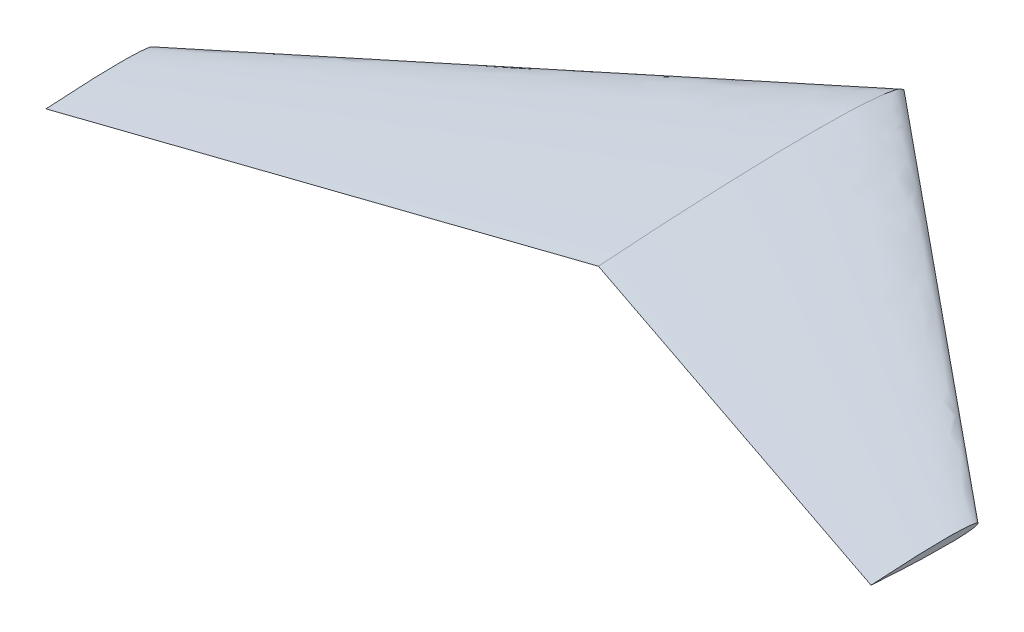
ISO-10303-21;
HEADER;
FILE_DESCRIPTION(('STEP AP214'),'2;1');
FILE_NAME('part.step','',(''),(''),'','','');
FILE_SCHEMA(('AUTOMOTIVE_DESIGN { 1 0 10303 214 1 1 1 1 }'));
ENDSEC;
DATA;
#1=APPLICATION_CONTEXT('core data for automotive mechanical design processes');
#2=APPLICATION_PROTOCOL_DEFINITION('international standard','automotive_design',2000,#1);
#3=PRODUCT_CONTEXT('',#1,'mechanical');
#4=PRODUCT('Part','Part','',(#3));
#5=PRODUCT_RELATED_PRODUCT_CATEGORY('part','',(#4));
#6=PRODUCT_DEFINITION_FORMATION('','',#4);
#7=PRODUCT_DEFINITION_CONTEXT('part definition',#1,'design');
#8=PRODUCT_DEFINITION('design','',#6,#7);
#9=PRODUCT_DEFINITION_SHAPE('','',#8);
#10=(LENGTH_UNIT() NAMED_UNIT(*) SI_UNIT(.MILLI.,.METRE.));
#11=(NAMED_UNIT(*) PLANE_ANGLE_UNIT() SI_UNIT($,.RADIAN.));
#12=(NAMED_UNIT(*) SI_UNIT($,.STERADIAN.) SOLID_ANGLE_UNIT());
#13=UNCERTAINTY_MEASURE_WITH_UNIT(LENGTH_MEASURE(1.E-05),#10,'distance_accuracy_value','');
#14=(GEOMETRIC_REPRESENTATION_CONTEXT(3) GLOBAL_UNCERTAINTY_ASSIGNED_CONTEXT((#13)) GLOBAL_UNIT_ASSIGNED_CONTEXT((#10,
#11,#12)) REPRESENTATION_CONTEXT('',''));
#15=CARTESIAN_POINT('',(0.,0.,0.));
#16=DIRECTION('',(0.,0.,1.));
#17=DIRECTION('',(1.,0.,0.));
#18=AXIS2_PLACEMENT_3D('',#15,#16,#17);
#19=CARTESIAN_POINT('',(11359.2161155703,76.8514653206255,10788.4222084638));
#20=DIRECTION('',(-1.,0.,0.));
#21=DIRECTION('',(0.,0.,-1.));
#22=AXIS2_PLACEMENT_3D('',#19,#20,#21);
#23=PLANE('',#22);
#24=CARTESIAN_POINT('',(11359.2161155703,-1.34095460673236E-12,12266.1037591124));
#25=CARTESIAN_POINT('',(11359.2161155703,18.8203520967069,11971.8910815032));
#26=CARTESIAN_POINT('',(11359.2161155703,49.9882583828807,11481.3378290713));
#27=CARTESIAN_POINT('',(11359.2161155703,70.9835794585614,10990.1821505142));
#28=CARTESIAN_POINT('',(11359.2161155703,82.3956799870032,10597.8339155743));
#29=CARTESIAN_POINT('',(11359.2161155703,85.4412528497841,10401.1726121632));
#30=CARTESIAN_POINT('',(11359.2161155703,86.9538383032913,10106.6703660128));
#31=CARTESIAN_POINT('',(11359.2161155703,86.9309217643893,10007.9894461031));
#32=CARTESIAN_POINT('',(11359.2161155703,82.4823559531746,9863.96128521647));
#33=CARTESIAN_POINT('',(11359.2161155703,80.1454595299337,9812.41655254454));
#34=CARTESIAN_POINT('',(11359.2161155703,74.7337293030059,9714.01184201355));
#35=CARTESIAN_POINT('',(11359.2161155703,71.3004715154824,9661.46365869842));
#36=CARTESIAN_POINT('',(11359.2161155703,65.8455880886711,9591.98239167028));
#37=CARTESIAN_POINT('',(11359.2161155703,63.8302413863627,9568.27058077111));
#38=CARTESIAN_POINT('',(11359.2161155703,58.7328780892101,9522.39970973608));
#39=CARTESIAN_POINT('',(11359.2161155703,55.1925855489482,9496.91518607539));
#40=CARTESIAN_POINT('',(11359.2161155703,45.0254946563833,9419.06959226612));
#41=CARTESIAN_POINT('',(11359.2161155703,39.0349502011655,9362.32915647395));
#42=CARTESIAN_POINT('',(11359.2161155703,0.,9321.12180322383));
#43=B_SPLINE_CURVE_WITH_KNOTS('',3,(#24,#25,#26,#27,#28,#29,#30,#31,#32,#33,#34,#35,#36,#37,#38,
#39,#40,#41,#42),.UNSPECIFIED.,.F.,.F.,(4,1,1,1,1,1,1,1,1,1,1,1,1,1,1,1,4),(0.,
0.298931815970666,0.498152968932553,0.498299211220126,0.696834066796415,0.697522121171649,
0.796796462208503,0.796844070583475,0.843589068570306,0.849087559843308,0.896763932817385,
0.896989321780881,0.919683005075993,0.920855221312246,0.943853286653914,0.945874325951042,1.),.UNSPECIFIED.);
#44=CARTESIAN_POINT('',(11359.2161155703,0.,9321.12180322383));
#45=VERTEX_POINT('',#44);
#46=CARTESIAN_POINT('',(11359.2161155703,-1.33877835778621E-12,12266.1037591124));
#47=VERTEX_POINT('',#46);
#48=EDGE_CURVE('E90',#45,#47,#43,.F.);
#49=ORIENTED_EDGE('',*,*,#48,.T.);
#50=CARTESIAN_POINT('',(11359.2161155703,0.,9321.12180322383));
#51=CARTESIAN_POINT('',(11359.2161155703,-39.0349502011679,9362.32915647395));
#52=CARTESIAN_POINT('',(11359.2161155703,-45.0254946563853,9419.06959226613));
#53=CARTESIAN_POINT('',(11359.2161155703,-55.1925855489501,9496.91518607539));
#54=CARTESIAN_POINT('',(11359.2161155703,-58.7328780892121,9522.39970973607));
#55=CARTESIAN_POINT('',(11359.2161155703,-63.8302413863647,9568.2705807711));
#56=CARTESIAN_POINT('',(11359.2161155703,-65.8455880886731,9591.98239167028));
#57=CARTESIAN_POINT('',(11359.2161155703,-71.3004715154844,9661.46365869842));
#58=CARTESIAN_POINT('',(11359.2161155703,-74.7337293030079,9714.01184201355));
#59=CARTESIAN_POINT('',(11359.2161155703,-80.1454595299357,9812.41655254454));
#60=CARTESIAN_POINT('',(11359.2161155703,-82.4823559531767,9863.96128521647));
#61=CARTESIAN_POINT('',(11359.2161155703,-86.9309217643914,10007.9894461031));
#62=CARTESIAN_POINT('',(11359.2161155703,-86.9538383032934,10106.6703660128));
#63=CARTESIAN_POINT('',(11359.2161155703,-85.4412528497863,10401.1726121632));
#64=CARTESIAN_POINT('',(11359.2161155703,-82.3956799870054,10597.8339155743));
#65=CARTESIAN_POINT('',(11359.2161155703,-70.9835794585637,10990.1821505142));
#66=CARTESIAN_POINT('',(11359.2161155703,-49.9882583828832,11481.3378290713));
#67=CARTESIAN_POINT('',(11359.2161155703,-18.8203520967096,11971.8910815032));
#68=CARTESIAN_POINT('',(11359.2161155703,-1.33877835778621E-12,12266.1037591124));
#69=B_SPLINE_CURVE_WITH_KNOTS('',3,(#50,#51,#52,#53,#54,#55,#56,#57,#58,#59,#60,#61,#62,#63,#64,
#65,#66,#67,#68),.UNSPECIFIED.,.F.,.F.,(4,1,1,1,1,1,1,1,1,1,1,1,1,1,1,1,4),(0.,
0.0541256740489585,0.0561467133460857,0.0791447786877544,0.0803169949240068,0.103010678219119,
0.103236067182615,0.150912440156692,0.156410931429694,0.203155929416525,0.203203537791498,
0.302477878828351,0.303165933203585,0.501700788779874,0.501847031067447,0.701068184029334,1.),.UNSPECIFIED.);
#70=EDGE_CURVE('E121',#47,#45,#69,.F.);
#71=ORIENTED_EDGE('',*,*,#70,.T.);
#72=EDGE_LOOP('',(#49,#71));
#73=FACE_BOUND('',#72,.T.);
#74=ADVANCED_FACE('F87',(#73),#23,.F.);
#75=CARTESIAN_POINT('',(-11359.2161155703,76.8514653206255,10788.4222084638));
#76=DIRECTION('',(1.,0.,0.));
#77=DIRECTION('',(0.,0.,-1.));
#78=AXIS2_PLACEMENT_3D('',#75,#76,#77);
#79=PLANE('',#78);
#80=CARTESIAN_POINT('',(-11359.2161155703,-1.34095460673236E-12,12266.1037591124));
#81=CARTESIAN_POINT('',(-11359.2161155703,18.8203520967069,11971.8910815032));
#82=CARTESIAN_POINT('',(-11359.2161155703,49.9882583828807,11481.3378290713));
#83=CARTESIAN_POINT('',(-11359.2161155703,70.9835794585614,10990.1821505142));
#84=CARTESIAN_POINT('',(-11359.2161155703,82.3956799870032,10597.8339155743));
#85=CARTESIAN_POINT('',(-11359.2161155703,85.4412528497841,10401.1726121632));
#86=CARTESIAN_POINT('',(-11359.2161155703,86.9538383032913,10106.6703660128));
#87=CARTESIAN_POINT('',(-11359.2161155703,86.9309217643893,10007.9894461031));
#88=CARTESIAN_POINT('',(-11359.2161155703,82.4823559531746,9863.96128521647));
#89=CARTESIAN_POINT('',(-11359.2161155703,80.1454595299337,9812.41655254454));
#90=CARTESIAN_POINT('',(-11359.2161155703,74.7337293030059,9714.01184201355));
#91=CARTESIAN_POINT('',(-11359.2161155703,71.3004715154824,9661.46365869842));
#92=CARTESIAN_POINT('',(-11359.2161155703,65.8455880886711,9591.98239167028));
#93=CARTESIAN_POINT('',(-11359.2161155703,63.8302413863627,9568.27058077111));
#94=CARTESIAN_POINT('',(-11359.2161155703,58.7328780892101,9522.39970973608));
#95=CARTESIAN_POINT('',(-11359.2161155703,55.1925855489482,9496.91518607539));
#96=CARTESIAN_POINT('',(-11359.2161155703,45.0254946563833,9419.06959226612));
#97=CARTESIAN_POINT('',(-11359.2161155703,39.0349502011655,9362.32915647395));
#98=CARTESIAN_POINT('',(-11359.2161155703,0.,9321.12180322383));
#99=B_SPLINE_CURVE_WITH_KNOTS('',3,(#80,#81,#82,#83,#84,#85,#86,#87,#88,#89,#90,#91,#92,#93,#94,
#95,#96,#97,#98),.UNSPECIFIED.,.F.,.F.,(4,1,1,1,1,1,1,1,1,1,1,1,1,1,1,1,4),(0.,
0.298931815970666,0.498152968932553,0.498299211220126,0.696834066796415,0.697522121171649,
0.796796462208503,0.796844070583475,0.843589068570306,0.849087559843308,0.896763932817385,
0.896989321780881,0.919683005075993,0.920855221312246,0.943853286653914,0.945874325951042,1.),.UNSPECIFIED.);
#100=CARTESIAN_POINT('',(-11359.2161155703,0.,9321.12180322383));
#101=VERTEX_POINT('',#100);
#102=CARTESIAN_POINT('',(-11359.2161155703,-1.33877835778621E-12,12266.1037591124));
#103=VERTEX_POINT('',#102);
#104=EDGE_CURVE('E99',#101,#103,#99,.F.);
#105=ORIENTED_EDGE('',*,*,#104,.F.);
#106=CARTESIAN_POINT('',(-11359.2161155703,0.,9321.12180322383));
#107=CARTESIAN_POINT('',(-11359.2161155703,-39.0349502011679,9362.32915647395));
#108=CARTESIAN_POINT('',(-11359.2161155703,-45.0254946563853,9419.06959226613));
#109=CARTESIAN_POINT('',(-11359.2161155703,-55.1925855489501,9496.91518607539));
#110=CARTESIAN_POINT('',(-11359.2161155703,-58.7328780892121,9522.39970973607));
#111=CARTESIAN_POINT('',(-11359.2161155703,-63.8302413863647,9568.2705807711));
#112=CARTESIAN_POINT('',(-11359.2161155703,-65.8455880886731,9591.98239167028));
#113=CARTESIAN_POINT('',(-11359.2161155703,-71.3004715154844,9661.46365869842));
#114=CARTESIAN_POINT('',(-11359.2161155703,-74.7337293030079,9714.01184201355));
#115=CARTESIAN_POINT('',(-11359.2161155703,-80.1454595299357,9812.41655254454));
#116=CARTESIAN_POINT('',(-11359.2161155703,-82.4823559531767,9863.96128521647));
#117=CARTESIAN_POINT('',(-11359.2161155703,-86.9309217643914,10007.9894461031));
#118=CARTESIAN_POINT('',(-11359.2161155703,-86.9538383032934,10106.6703660128));
#119=CARTESIAN_POINT('',(-11359.2161155703,-85.4412528497863,10401.1726121632));
#120=CARTESIAN_POINT('',(-11359.2161155703,-82.3956799870054,10597.8339155743));
#121=CARTESIAN_POINT('',(-11359.2161155703,-70.9835794585637,10990.1821505142));
#122=CARTESIAN_POINT('',(-11359.2161155703,-49.9882583828832,11481.3378290713));
#123=CARTESIAN_POINT('',(-11359.2161155703,-18.8203520967096,11971.8910815032));
#124=CARTESIAN_POINT('',(-11359.2161155703,-1.33877835778621E-12,12266.1037591124));
#125=B_SPLINE_CURVE_WITH_KNOTS('',3,(#106,#107,#108,#109,#110,#111,#112,#113,#114,#115,#116,
#117,#118,#119,#120,#121,#122,#123,#124),.UNSPECIFIED.,.F.,.F.,(4,1,1,1,1,1,1,1,1,1,1,1,1,1,1,1,
4),(0.,0.0541256740489585,0.0561467133460857,0.0791447786877544,0.0803169949240068,
0.103010678219119,0.103236067182615,0.150912440156692,0.156410931429694,0.203155929416525,
0.203203537791498,0.302477878828351,0.303165933203585,0.501700788779874,0.501847031067447,
0.701068184029334,1.),.UNSPECIFIED.);
#126=EDGE_CURVE('E159',#103,#101,#125,.F.);
#127=ORIENTED_EDGE('',*,*,#126,.F.);
#128=EDGE_LOOP('',(#105,#127));
#129=FACE_BOUND('',#128,.T.);
#130=ADVANCED_FACE('F213',(#129),#79,.F.);
#131=CARTESIAN_POINT('',(0.,-1.03584151514388E-12,8414.2341596817));
#132=CARTESIAN_POINT('',(11359.2161155703,-1.34095460673236E-12,12266.1037591124));
#133=CARTESIAN_POINT('',(0.,64.7920514607161,7574.06443176734));
#134=CARTESIAN_POINT('',(11359.2161155703,18.8203520967069,11971.8910815032));
#135=CARTESIAN_POINT('',(0.,148.494411022616,6172.1296219586));
#136=CARTESIAN_POINT('',(11359.2161155703,49.9882583828807,11481.3378290713));
#137=CARTESIAN_POINT('',(0.,208.057487147225,4768.80033309058));
#138=CARTESIAN_POINT('',(11359.2161155703,70.9835794585614,10990.1821505142));
#139=CARTESIAN_POINT('',(0.,244.442770083536,3647.59962187171));
#140=CARTESIAN_POINT('',(11359.2161155703,82.3956799870032,10597.8339155743));
#141=CARTESIAN_POINT('',(0.,257.091372536718,3085.51507252471));
#142=CARTESIAN_POINT('',(11359.2161155703,85.4412528497841,10401.1726121632));
#143=CARTESIAN_POINT('',(0.,253.102036890415,2244.22059630675));
#144=CARTESIAN_POINT('',(11359.2161155703,86.9538383032913,10106.6703660128));
#145=CARTESIAN_POINT('',(0.,247.902646496169,1962.39382293248));
#146=CARTESIAN_POINT('',(11359.2161155703,86.9309217643893,10007.9894461031));
#147=CARTESIAN_POINT('',(0.,240.689336539155,1550.55652902122));
#148=CARTESIAN_POINT('',(11359.2161155703,82.4823559531746,9863.96128521647));
#149=CARTESIAN_POINT('',(0.,238.171676754806,1403.08364495362));
#150=CARTESIAN_POINT('',(11359.2161155703,80.1454595299337,9812.41655254454));
#151=CARTESIAN_POINT('',(0.,222.91221545098,1121.94901643392));
#152=CARTESIAN_POINT('',(11359.2161155703,74.7337293030059,9714.01184201355));
#153=CARTESIAN_POINT('',(0.,208.396099353381,972.109774250955));
#154=CARTESIAN_POINT('',(11359.2161155703,71.3004715154824,9661.46365869842));
#155=CARTESIAN_POINT('',(0.,194.440638219348,773.448943042979));
#156=CARTESIAN_POINT('',(11359.2161155703,65.8455880886711,9591.98239167028));
#157=CARTESIAN_POINT('',(0.,190.542859216547,705.559975496836));
#158=CARTESIAN_POINT('',(11359.2161155703,63.8302413863627,9568.27058077111));
#159=CARTESIAN_POINT('',(0.,176.271721196786,574.429923088583));
#160=CARTESIAN_POINT('',(11359.2161155703,58.7328780892101,9522.39970973608));
#161=CARTESIAN_POINT('',(0.,164.724712547587,501.620254564058));
#162=CARTESIAN_POINT('',(11359.2161155703,55.1925855489482,9496.91518607539));
#163=CARTESIAN_POINT('',(0.,131.844814983985,279.946911371155));
#164=CARTESIAN_POINT('',(11359.2161155703,45.0254946563833,9419.06959226612));
#165=CARTESIAN_POINT('',(0.,108.2931123675,121.364540484391));
#166=CARTESIAN_POINT('',(11359.2161155703,39.0349502011655,9362.32915647395));
#167=CARTESIAN_POINT('',(0.,0.,0.));
#168=CARTESIAN_POINT('',(11359.2161155703,0.,9321.12180322383));
#169=B_SPLINE_SURFACE_WITH_KNOTS('',3,1,((#131,#132),(#133,#134),(#135,#136),(#137,#138),(#139,
#140),(#141,#142),(#143,#144),(#145,#146),(#147,#148),(#149,#150),(#151,#152),(#153,#154),(#155,
#156),(#157,#158),(#159,#160),(#161,#162),(#163,#164),(#165,#166),(#167,#168)),.UNSPECIFIED.,
.F.,.F.,.F.,(4,1,1,1,1,1,1,1,1,1,1,1,1,1,1,1,4),(2,2),(0.,0.298931815970666,0.498152968932553,
0.498299211220126,0.696834066796415,0.697522121171649,0.796796462208503,0.796844070583475,
0.843589068570306,0.849087559843308,0.896763932817385,0.896989321780881,0.919683005075993,
0.920855221312246,0.943853286653914,0.945874325951042,1.),(0.,1.),.UNSPECIFIED.);
#170=CARTESIAN_POINT('',(0.,-1.03584151514388E-12,8414.2341596817));
#171=CARTESIAN_POINT('',(0.,64.7920514607161,7574.06443176734));
#172=CARTESIAN_POINT('',(0.,148.494411022616,6172.1296219586));
#173=CARTESIAN_POINT('',(0.,208.057487147225,4768.80033309058));
#174=CARTESIAN_POINT('',(0.,244.442770083536,3647.59962187171));
#175=CARTESIAN_POINT('',(0.,257.091372536718,3085.51507252471));
#176=CARTESIAN_POINT('',(0.,253.102036890415,2244.22059630675));
#177=CARTESIAN_POINT('',(0.,247.902646496169,1962.39382293248));
#178=CARTESIAN_POINT('',(0.,240.689336539155,1550.55652902122));
#179=CARTESIAN_POINT('',(0.,238.171676754806,1403.08364495362));
#180=CARTESIAN_POINT('',(0.,222.91221545098,1121.94901643392));
#181=CARTESIAN_POINT('',(0.,208.396099353381,972.109774250955));
#182=CARTESIAN_POINT('',(0.,194.440638219348,773.448943042979));
#183=CARTESIAN_POINT('',(0.,190.542859216547,705.559975496836));
#184=CARTESIAN_POINT('',(0.,176.271721196786,574.429923088583));
#185=CARTESIAN_POINT('',(0.,164.724712547587,501.620254564058));
#186=CARTESIAN_POINT('',(0.,131.844814983985,279.946911371155));
#187=CARTESIAN_POINT('',(0.,108.2931123675,121.364540484391));
#188=CARTESIAN_POINT('',(0.,0.,0.));
#189=B_SPLINE_CURVE_WITH_KNOTS('',3,(#170,#171,#172,#173,#174,#175,#176,#177,#178,#179,#180,
#181,#182,#183,#184,#185,#186,#187,#188),.UNSPECIFIED.,.F.,.F.,(4,1,1,1,1,1,1,1,1,1,1,1,1,1,1,1,
4),(0.,0.298931815970666,0.498152968932553,0.498299211220126,0.696834066796415,
0.697522121171649,0.796796462208503,0.796844070583475,0.843589068570306,0.849087559843308,
0.896763932817385,0.896989321780881,0.919683005075993,0.920855221312246,0.943853286653914,
0.945874325951042,1.),.UNSPECIFIED.);
#190=CARTESIAN_POINT('',(0.,-1.02505147104222E-12,8414.2341596817));
#191=VERTEX_POINT('',#190);
#192=CARTESIAN_POINT('',(0.,0.,0.));
#193=VERTEX_POINT('',#192);
#194=EDGE_CURVE('E49',#191,#193,#189,.T.);
#195=DIRECTION('',(0.947033228842652,0.,0.321135584244195));
#196=VECTOR('',#195,1.);
#197=CARTESIAN_POINT('',(5679.60805778514,-1.18191491441422E-12,10340.1689593971));
#198=LINE('',#197,#196);
#199=EDGE_CURVE('E126',#191,#47,#198,.T.);
#200=DIRECTION('',(-0.773048696155329,0.,-0.634346682321699));
#201=VECTOR('',#200,1.);
#202=CARTESIAN_POINT('',(5679.60805778514,0.,4660.56090161192));
#203=LINE('',#202,#201);
#204=EDGE_CURVE('E127',#45,#193,#203,.T.);
#205=ORIENTED_EDGE('',*,*,#194,.F.);
#206=ORIENTED_EDGE('',*,*,#199,.T.);
#207=ORIENTED_EDGE('',*,*,#48,.F.);
#208=ORIENTED_EDGE('',*,*,#204,.T.);
#209=EDGE_LOOP('',(#205,#206,#207,#208));
#210=FACE_BOUND('',#209,.T.);
#211=ADVANCED_FACE('F132',(#210),#169,.F.);
#212=CARTESIAN_POINT('',(0.,0.,0.));
#213=CARTESIAN_POINT('',(11359.2161155703,0.,9321.12180322383));
#214=CARTESIAN_POINT('',(0.,-108.293112367501,121.364540484392));
#215=CARTESIAN_POINT('',(11359.2161155703,-39.0349502011679,9362.32915647395));
#216=CARTESIAN_POINT('',(0.,-131.844814983985,279.946911371156));
#217=CARTESIAN_POINT('',(11359.2161155703,-45.0254946563853,9419.06959226613));
#218=CARTESIAN_POINT('',(0.,-164.724712547587,501.62025456406));
#219=CARTESIAN_POINT('',(11359.2161155703,-55.1925855489501,9496.91518607539));
#220=CARTESIAN_POINT('',(0.,-176.271721196787,574.429923088584));
#221=CARTESIAN_POINT('',(11359.2161155703,-58.7328780892121,9522.39970973607));
#222=CARTESIAN_POINT('',(0.,-190.542859216548,705.559975496837));
#223=CARTESIAN_POINT('',(11359.2161155703,-63.8302413863647,9568.2705807711));
#224=CARTESIAN_POINT('',(0.,-194.440638219348,773.44894304298));
#225=CARTESIAN_POINT('',(11359.2161155703,-65.8455880886731,9591.98239167028));
#226=CARTESIAN_POINT('',(0.,-208.396099353381,972.109774250955));
#227=CARTESIAN_POINT('',(11359.2161155703,-71.3004715154844,9661.46365869842));
#228=CARTESIAN_POINT('',(0.,-222.912215450981,1121.94901643392));
#229=CARTESIAN_POINT('',(11359.2161155703,-74.7337293030079,9714.01184201355));
#230=CARTESIAN_POINT('',(0.,-238.171676754807,1403.08364495363));
#231=CARTESIAN_POINT('',(11359.2161155703,-80.1454595299357,9812.41655254454));
#232=CARTESIAN_POINT('',(0.,-240.689336539155,1550.55652902122));
#233=CARTESIAN_POINT('',(11359.2161155703,-82.4823559531767,9863.96128521647));
#234=CARTESIAN_POINT('',(0.,-247.902646496169,1962.39382293248));
#235=CARTESIAN_POINT('',(11359.2161155703,-86.9309217643914,10007.9894461031));
#236=CARTESIAN_POINT('',(0.,-253.102036890416,2244.22059630675));
#237=CARTESIAN_POINT('',(11359.2161155703,-86.9538383032934,10106.6703660128));
#238=CARTESIAN_POINT('',(0.,-257.091372536719,3085.51507252471));
#239=CARTESIAN_POINT('',(11359.2161155703,-85.4412528497863,10401.1726121632));
#240=CARTESIAN_POINT('',(0.,-244.442770083537,3647.59962187172));
#241=CARTESIAN_POINT('',(11359.2161155703,-82.3956799870054,10597.8339155743));
#242=CARTESIAN_POINT('',(0.,-208.057487147226,4768.80033309058));
#243=CARTESIAN_POINT('',(11359.2161155703,-70.9835794585637,10990.1821505142));
#244=CARTESIAN_POINT('',(0.,-148.494411022618,6172.1296219586));
#245=CARTESIAN_POINT('',(11359.2161155703,-49.9882583828832,11481.3378290713));
#246=CARTESIAN_POINT('',(0.,-64.792051460718,7574.06443176734));
#247=CARTESIAN_POINT('',(11359.2161155703,-18.8203520967096,11971.8910815032));
#248=CARTESIAN_POINT('',(0.,-1.02505147104222E-12,8414.2341596817));
#249=CARTESIAN_POINT('',(11359.2161155703,-1.33877835778621E-12,12266.1037591124));
#250=B_SPLINE_SURFACE_WITH_KNOTS('',3,1,((#212,#213),(#214,#215),(#216,#217),(#218,#219),(#220,
#221),(#222,#223),(#224,#225),(#226,#227),(#228,#229),(#230,#231),(#232,#233),(#234,#235),(#236,
#237),(#238,#239),(#240,#241),(#242,#243),(#244,#245),(#246,#247),(#248,#249)),.UNSPECIFIED.,
.F.,.F.,.F.,(4,1,1,1,1,1,1,1,1,1,1,1,1,1,1,1,4),(2,2),(0.,0.0541256740489585,0.0561467133460857,
0.0791447786877544,0.0803169949240068,0.103010678219119,0.103236067182615,0.150912440156692,
0.156410931429694,0.203155929416525,0.203203537791498,0.302477878828351,0.303165933203585,
0.501700788779874,0.501847031067447,0.701068184029334,1.),(0.,1.),.UNSPECIFIED.);
#251=CARTESIAN_POINT('',(0.,0.,0.));
#252=CARTESIAN_POINT('',(0.,-108.293112367501,121.364540484392));
#253=CARTESIAN_POINT('',(0.,-131.844814983985,279.946911371156));
#254=CARTESIAN_POINT('',(0.,-164.724712547587,501.62025456406));
#255=CARTESIAN_POINT('',(0.,-176.271721196787,574.429923088584));
#256=CARTESIAN_POINT('',(0.,-190.542859216548,705.559975496837));
#257=CARTESIAN_POINT('',(0.,-194.440638219348,773.44894304298));
#258=CARTESIAN_POINT('',(0.,-208.396099353381,972.109774250955));
#259=CARTESIAN_POINT('',(0.,-222.912215450981,1121.94901643392));
#260=CARTESIAN_POINT('',(0.,-238.171676754807,1403.08364495363));
#261=CARTESIAN_POINT('',(0.,-240.689336539155,1550.55652902122));
#262=CARTESIAN_POINT('',(0.,-247.902646496169,1962.39382293248));
#263=CARTESIAN_POINT('',(0.,-253.102036890416,2244.22059630675));
#264=CARTESIAN_POINT('',(0.,-257.091372536719,3085.51507252471));
#265=CARTESIAN_POINT('',(0.,-244.442770083537,3647.59962187172));
#266=CARTESIAN_POINT('',(0.,-208.057487147226,4768.80033309058));
#267=CARTESIAN_POINT('',(0.,-148.494411022618,6172.1296219586));
#268=CARTESIAN_POINT('',(0.,-64.792051460718,7574.06443176734));
#269=CARTESIAN_POINT('',(0.,-1.02505147104222E-12,8414.2341596817));
#270=B_SPLINE_CURVE_WITH_KNOTS('',3,(#251,#252,#253,#254,#255,#256,#257,#258,#259,#260,#261,
#262,#263,#264,#265,#266,#267,#268,#269),.UNSPECIFIED.,.F.,.F.,(4,1,1,1,1,1,1,1,1,1,1,1,1,1,1,1,
4),(0.,0.0541256740489585,0.0561467133460857,0.0791447786877544,0.0803169949240068,
0.103010678219119,0.103236067182615,0.150912440156692,0.156410931429694,0.203155929416525,
0.203203537791498,0.302477878828351,0.303165933203585,0.501700788779874,0.501847031067447,
0.701068184029334,1.),.UNSPECIFIED.);
#271=EDGE_CURVE('E137',#193,#191,#270,.T.);
#272=ORIENTED_EDGE('',*,*,#271,.F.);
#273=ORIENTED_EDGE('',*,*,#204,.F.);
#274=ORIENTED_EDGE('',*,*,#70,.F.);
#275=ORIENTED_EDGE('',*,*,#199,.F.);
#276=EDGE_LOOP('',(#272,#273,#274,#275));
#277=FACE_BOUND('',#276,.T.);
#278=ADVANCED_FACE('F135',(#277),#250,.F.);
#279=CARTESIAN_POINT('',(0.,-1.03584151514388E-12,8414.2341596817));
#280=CARTESIAN_POINT('',(-11359.2161155703,-1.34095460673236E-12,12266.1037591124));
#281=CARTESIAN_POINT('',(0.,64.7920514607161,7574.06443176734));
#282=CARTESIAN_POINT('',(-11359.2161155703,18.8203520967069,11971.8910815032));
#283=CARTESIAN_POINT('',(0.,148.494411022616,6172.1296219586));
#284=CARTESIAN_POINT('',(-11359.2161155703,49.9882583828807,11481.3378290713));
#285=CARTESIAN_POINT('',(0.,208.057487147225,4768.80033309058));
#286=CARTESIAN_POINT('',(-11359.2161155703,70.9835794585614,10990.1821505142));
#287=CARTESIAN_POINT('',(0.,244.442770083536,3647.59962187171));
#288=CARTESIAN_POINT('',(-11359.2161155703,82.3956799870032,10597.8339155743));
#289=CARTESIAN_POINT('',(0.,257.091372536718,3085.51507252471));
#290=CARTESIAN_POINT('',(-11359.2161155703,85.4412528497841,10401.1726121632));
#291=CARTESIAN_POINT('',(0.,253.102036890415,2244.22059630675));
#292=CARTESIAN_POINT('',(-11359.2161155703,86.9538383032913,10106.6703660128));
#293=CARTESIAN_POINT('',(0.,247.902646496169,1962.39382293248));
#294=CARTESIAN_POINT('',(-11359.2161155703,86.9309217643893,10007.9894461031));
#295=CARTESIAN_POINT('',(0.,240.689336539155,1550.55652902122));
#296=CARTESIAN_POINT('',(-11359.2161155703,82.4823559531746,9863.96128521647));
#297=CARTESIAN_POINT('',(0.,238.171676754806,1403.08364495362));
#298=CARTESIAN_POINT('',(-11359.2161155703,80.1454595299337,9812.41655254454));
#299=CARTESIAN_POINT('',(0.,222.91221545098,1121.94901643392));
#300=CARTESIAN_POINT('',(-11359.2161155703,74.7337293030059,9714.01184201355));
#301=CARTESIAN_POINT('',(0.,208.396099353381,972.109774250955));
#302=CARTESIAN_POINT('',(-11359.2161155703,71.3004715154824,9661.46365869842));
#303=CARTESIAN_POINT('',(0.,194.440638219348,773.448943042979));
#304=CARTESIAN_POINT('',(-11359.2161155703,65.8455880886711,9591.98239167028));
#305=CARTESIAN_POINT('',(0.,190.542859216547,705.559975496836));
#306=CARTESIAN_POINT('',(-11359.2161155703,63.8302413863627,9568.27058077111));
#307=CARTESIAN_POINT('',(0.,176.271721196786,574.429923088583));
#308=CARTESIAN_POINT('',(-11359.2161155703,58.7328780892101,9522.39970973608));
#309=CARTESIAN_POINT('',(0.,164.724712547587,501.620254564058));
#310=CARTESIAN_POINT('',(-11359.2161155703,55.1925855489482,9496.91518607539));
#311=CARTESIAN_POINT('',(0.,131.844814983985,279.946911371155));
#312=CARTESIAN_POINT('',(-11359.2161155703,45.0254946563833,9419.06959226612));
#313=CARTESIAN_POINT('',(0.,108.2931123675,121.364540484391));
#314=CARTESIAN_POINT('',(-11359.2161155703,39.0349502011655,9362.32915647395));
#315=CARTESIAN_POINT('',(0.,0.,0.));
#316=CARTESIAN_POINT('',(-11359.2161155703,0.,9321.12180322383));
#317=B_SPLINE_SURFACE_WITH_KNOTS('',3,1,((#279,#280),(#281,#282),(#283,#284),(#285,#286),(#287,
#288),(#289,#290),(#291,#292),(#293,#294),(#295,#296),(#297,#298),(#299,#300),(#301,#302),(#303,
#304),(#305,#306),(#307,#308),(#309,#310),(#311,#312),(#313,#314),(#315,#316)),.UNSPECIFIED.,
.F.,.F.,.F.,(4,1,1,1,1,1,1,1,1,1,1,1,1,1,1,1,4),(2,2),(0.,0.298931815970666,0.498152968932553,
0.498299211220126,0.696834066796415,0.697522121171649,0.796796462208503,0.796844070583475,
0.843589068570306,0.849087559843308,0.896763932817385,0.896989321780881,0.919683005075993,
0.920855221312246,0.943853286653914,0.945874325951042,1.),(0.,1.),.UNSPECIFIED.);
#318=DIRECTION('',(0.773048696155329,0.,-0.634346682321699));
#319=VECTOR('',#318,1.);
#320=CARTESIAN_POINT('',(-5679.60805778514,0.,4660.56090161192));
#321=LINE('',#320,#319);
#322=EDGE_CURVE('E134',#101,#193,#321,.T.);
#323=DIRECTION('',(-0.947033228842652,0.,0.321135584244195));
#324=VECTOR('',#323,1.);
#325=CARTESIAN_POINT('',(-5679.60805778514,-1.18191491441422E-12,10340.1689593971));
#326=LINE('',#325,#324);
#327=EDGE_CURVE('E160',#191,#103,#326,.T.);
#328=ORIENTED_EDGE('',*,*,#194,.T.);
#329=ORIENTED_EDGE('',*,*,#322,.F.);
#330=ORIENTED_EDGE('',*,*,#104,.T.);
#331=ORIENTED_EDGE('',*,*,#327,.F.);
#332=EDGE_LOOP('',(#328,#329,#330,#331));
#333=FACE_BOUND('',#332,.T.);
#334=ADVANCED_FACE('F184',(#333),#317,.T.);
#335=CARTESIAN_POINT('',(0.,0.,0.));
#336=CARTESIAN_POINT('',(-11359.2161155703,0.,9321.12180322383));
#337=CARTESIAN_POINT('',(0.,-108.293112367501,121.364540484392));
#338=CARTESIAN_POINT('',(-11359.2161155703,-39.0349502011679,9362.32915647395));
#339=CARTESIAN_POINT('',(0.,-131.844814983985,279.946911371156));
#340=CARTESIAN_POINT('',(-11359.2161155703,-45.0254946563853,9419.06959226613));
#341=CARTESIAN_POINT('',(0.,-164.724712547587,501.62025456406));
#342=CARTESIAN_POINT('',(-11359.2161155703,-55.1925855489501,9496.91518607539));
#343=CARTESIAN_POINT('',(0.,-176.271721196787,574.429923088584));
#344=CARTESIAN_POINT('',(-11359.2161155703,-58.7328780892121,9522.39970973607));
#345=CARTESIAN_POINT('',(0.,-190.542859216548,705.559975496837));
#346=CARTESIAN_POINT('',(-11359.2161155703,-63.8302413863647,9568.2705807711));
#347=CARTESIAN_POINT('',(0.,-194.440638219348,773.44894304298));
#348=CARTESIAN_POINT('',(-11359.2161155703,-65.8455880886731,9591.98239167028));
#349=CARTESIAN_POINT('',(0.,-208.396099353381,972.109774250955));
#350=CARTESIAN_POINT('',(-11359.2161155703,-71.3004715154844,9661.46365869842));
#351=CARTESIAN_POINT('',(0.,-222.912215450981,1121.94901643392));
#352=CARTESIAN_POINT('',(-11359.2161155703,-74.7337293030079,9714.01184201355));
#353=CARTESIAN_POINT('',(0.,-238.171676754807,1403.08364495363));
#354=CARTESIAN_POINT('',(-11359.2161155703,-80.1454595299357,9812.41655254454));
#355=CARTESIAN_POINT('',(0.,-240.689336539155,1550.55652902122));
#356=CARTESIAN_POINT('',(-11359.2161155703,-82.4823559531767,9863.96128521647));
#357=CARTESIAN_POINT('',(0.,-247.902646496169,1962.39382293248));
#358=CARTESIAN_POINT('',(-11359.2161155703,-86.9309217643914,10007.9894461031));
#359=CARTESIAN_POINT('',(0.,-253.102036890416,2244.22059630675));
#360=CARTESIAN_POINT('',(-11359.2161155703,-86.9538383032934,10106.6703660128));
#361=CARTESIAN_POINT('',(0.,-257.091372536719,3085.51507252471));
#362=CARTESIAN_POINT('',(-11359.2161155703,-85.4412528497863,10401.1726121632));
#363=CARTESIAN_POINT('',(0.,-244.442770083537,3647.59962187172));
#364=CARTESIAN_POINT('',(-11359.2161155703,-82.3956799870054,10597.8339155743));
#365=CARTESIAN_POINT('',(0.,-208.057487147226,4768.80033309058));
#366=CARTESIAN_POINT('',(-11359.2161155703,-70.9835794585637,10990.1821505142));
#367=CARTESIAN_POINT('',(0.,-148.494411022618,6172.1296219586));
#368=CARTESIAN_POINT('',(-11359.2161155703,-49.9882583828832,11481.3378290713));
#369=CARTESIAN_POINT('',(0.,-64.792051460718,7574.06443176734));
#370=CARTESIAN_POINT('',(-11359.2161155703,-18.8203520967096,11971.8910815032));
#371=CARTESIAN_POINT('',(0.,-1.02505147104222E-12,8414.2341596817));
#372=CARTESIAN_POINT('',(-11359.2161155703,-1.33877835778621E-12,12266.1037591124));
#373=B_SPLINE_SURFACE_WITH_KNOTS('',3,1,((#335,#336),(#337,#338),(#339,#340),(#341,#342),(#343,
#344),(#345,#346),(#347,#348),(#349,#350),(#351,#352),(#353,#354),(#355,#356),(#357,#358),(#359,
#360),(#361,#362),(#363,#364),(#365,#366),(#367,#368),(#369,#370),(#371,#372)),.UNSPECIFIED.,
.F.,.F.,.F.,(4,1,1,1,1,1,1,1,1,1,1,1,1,1,1,1,4),(2,2),(0.,0.0541256740489585,0.0561467133460857,
0.0791447786877544,0.0803169949240068,0.103010678219119,0.103236067182615,0.150912440156692,
0.156410931429694,0.203155929416525,0.203203537791498,0.302477878828351,0.303165933203585,
0.501700788779874,0.501847031067447,0.701068184029334,1.),(0.,1.),.UNSPECIFIED.);
#374=ORIENTED_EDGE('',*,*,#271,.T.);
#375=ORIENTED_EDGE('',*,*,#327,.T.);
#376=ORIENTED_EDGE('',*,*,#126,.T.);
#377=ORIENTED_EDGE('',*,*,#322,.T.);
#378=EDGE_LOOP('',(#374,#375,#376,#377));
#379=FACE_BOUND('',#378,.T.);
#380=ADVANCED_FACE('F181',(#379),#373,.T.);
#381=CLOSED_SHELL('',(#74,#130,#211,#278,#334,#380));
#382=MANIFOLD_SOLID_BREP('B6',#381);
#383=ADVANCED_BREP_SHAPE_REPRESENTATION('',(#18,#382),#14);
#384=SHAPE_DEFINITION_REPRESENTATION(#9,#383);
ENDSEC;
END-ISO-10303-21;
